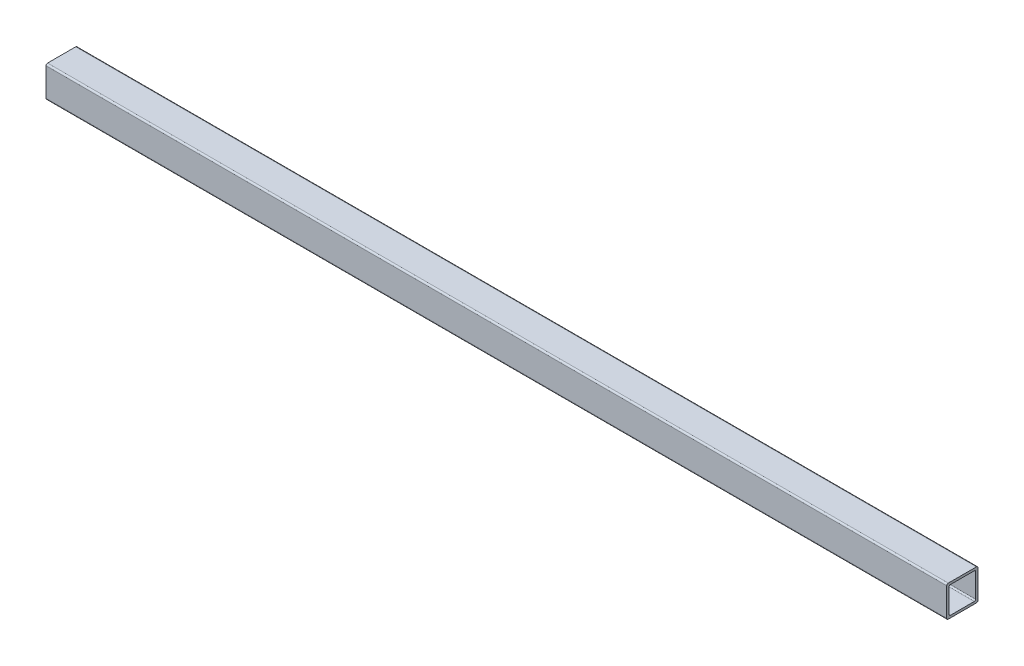
ISO-10303-21;
HEADER;
FILE_DESCRIPTION(('STEP AP214'),'2;1');
FILE_NAME('part.step','',(''),(''),'','','');
FILE_SCHEMA(('AUTOMOTIVE_DESIGN { 1 0 10303 214 1 1 1 1 }'));
ENDSEC;
DATA;
#1=APPLICATION_CONTEXT('core data for automotive mechanical design processes');
#2=APPLICATION_PROTOCOL_DEFINITION('international standard','automotive_design',2000,#1);
#3=PRODUCT_CONTEXT('',#1,'mechanical');
#4=PRODUCT('Part','Part','',(#3));
#5=PRODUCT_RELATED_PRODUCT_CATEGORY('part','',(#4));
#6=PRODUCT_DEFINITION_FORMATION('','',#4);
#7=PRODUCT_DEFINITION_CONTEXT('part definition',#1,'design');
#8=PRODUCT_DEFINITION('design','',#6,#7);
#9=PRODUCT_DEFINITION_SHAPE('','',#8);
#10=(LENGTH_UNIT() NAMED_UNIT(*) SI_UNIT(.MILLI.,.METRE.));
#11=(NAMED_UNIT(*) PLANE_ANGLE_UNIT() SI_UNIT($,.RADIAN.));
#12=(NAMED_UNIT(*) SI_UNIT($,.STERADIAN.) SOLID_ANGLE_UNIT());
#13=UNCERTAINTY_MEASURE_WITH_UNIT(LENGTH_MEASURE(1.E-05),#10,'distance_accuracy_value','');
#14=(GEOMETRIC_REPRESENTATION_CONTEXT(3) GLOBAL_UNCERTAINTY_ASSIGNED_CONTEXT((#13)) GLOBAL_UNIT_ASSIGNED_CONTEXT((#10,
#11,#12)) REPRESENTATION_CONTEXT('',''));
#15=CARTESIAN_POINT('',(0.,0.,0.));
#16=DIRECTION('',(0.,0.,1.));
#17=DIRECTION('',(1.,0.,0.));
#18=AXIS2_PLACEMENT_3D('',#15,#16,#17);
#19=CARTESIAN_POINT('',(-914.4,-28.575,-28.575));
#20=DIRECTION('',(1.,0.,0.));
#21=DIRECTION('',(0.,1.,0.));
#22=AXIS2_PLACEMENT_3D('',#19,#20,#21);
#23=CYLINDRICAL_SURFACE('',#22,3.175);
#24=CARTESIAN_POINT('',(914.4,-28.5750000000003,-28.575));
#25=DIRECTION('',(-1.,0.,0.));
#26=DIRECTION('',(0.,-1.,0.));
#27=AXIS2_PLACEMENT_3D('',#24,#25,#26);
#28=CIRCLE('',#27,3.175);
#29=CARTESIAN_POINT('',(914.4,-28.5750000000003,-31.75));
#30=VERTEX_POINT('',#29);
#31=CARTESIAN_POINT('',(914.4,-31.7500000000003,-28.575));
#32=VERTEX_POINT('',#31);
#33=EDGE_CURVE('E252',#30,#32,#28,.T.);
#34=ORIENTED_EDGE('',*,*,#33,.T.);
#35=DIRECTION('',(1.,0.,0.));
#36=VECTOR('',#35,1.);
#37=CARTESIAN_POINT('',(-914.4,-31.75,-28.575));
#38=LINE('',#37,#36);
#39=CARTESIAN_POINT('',(-914.4,-31.75,-28.575));
#40=VERTEX_POINT('',#39);
#41=EDGE_CURVE('E12',#40,#32,#38,.T.);
#42=ORIENTED_EDGE('',*,*,#41,.F.);
#43=CARTESIAN_POINT('',(-914.4,-28.575,-28.575));
#44=DIRECTION('',(-1.,0.,0.));
#45=DIRECTION('',(0.,-1.,0.));
#46=AXIS2_PLACEMENT_3D('',#43,#44,#45);
#47=CIRCLE('',#46,3.175);
#48=CARTESIAN_POINT('',(-914.4,-28.575,-31.75));
#49=VERTEX_POINT('',#48);
#50=EDGE_CURVE('E358',#49,#40,#47,.T.);
#51=ORIENTED_EDGE('',*,*,#50,.F.);
#52=DIRECTION('',(1.,0.,0.));
#53=VECTOR('',#52,1.);
#54=CARTESIAN_POINT('',(-914.4,-28.575,-31.75));
#55=LINE('',#54,#53);
#56=EDGE_CURVE('E275',#49,#30,#55,.T.);
#57=ORIENTED_EDGE('',*,*,#56,.T.);
#58=EDGE_LOOP('',(#34,#42,#51,#57));
#59=FACE_BOUND('',#58,.T.);
#60=ADVANCED_FACE('F67',(#59),#23,.T.);
#61=CARTESIAN_POINT('',(-914.4,-31.75,-28.575));
#62=DIRECTION('',(0.,1.,0.));
#63=DIRECTION('',(-1.,0.,0.));
#64=AXIS2_PLACEMENT_3D('',#61,#62,#63);
#65=PLANE('',#64);
#66=DIRECTION('',(0.,0.,1.));
#67=VECTOR('',#66,1.);
#68=CARTESIAN_POINT('',(914.4,-31.7500000000003,-28.575));
#69=LINE('',#68,#67);
#70=CARTESIAN_POINT('',(914.4,-31.7500000000003,28.575));
#71=VERTEX_POINT('',#70);
#72=EDGE_CURVE('E256',#32,#71,#69,.T.);
#73=ORIENTED_EDGE('',*,*,#72,.T.);
#74=DIRECTION('',(1.,0.,0.));
#75=VECTOR('',#74,1.);
#76=CARTESIAN_POINT('',(-914.4,-31.75,28.575));
#77=LINE('',#76,#75);
#78=CARTESIAN_POINT('',(-914.4,-31.75,28.575));
#79=VERTEX_POINT('',#78);
#80=EDGE_CURVE('E78',#79,#71,#77,.T.);
#81=ORIENTED_EDGE('',*,*,#80,.F.);
#82=DIRECTION('',(0.,0.,1.));
#83=VECTOR('',#82,1.);
#84=CARTESIAN_POINT('',(-914.4,-31.75,-28.575));
#85=LINE('',#84,#83);
#86=EDGE_CURVE('E361',#40,#79,#85,.T.);
#87=ORIENTED_EDGE('',*,*,#86,.F.);
#88=ORIENTED_EDGE('',*,*,#41,.T.);
#89=EDGE_LOOP('',(#73,#81,#87,#88));
#90=FACE_BOUND('',#89,.T.);
#91=ADVANCED_FACE('F400',(#90),#65,.F.);
#92=CARTESIAN_POINT('',(-914.4,-28.575,28.575));
#93=DIRECTION('',(1.,0.,0.));
#94=DIRECTION('',(0.,1.,0.));
#95=AXIS2_PLACEMENT_3D('',#92,#93,#94);
#96=CYLINDRICAL_SURFACE('',#95,3.175);
#97=CARTESIAN_POINT('',(914.4,-28.5750000000003,28.575));
#98=DIRECTION('',(-1.,0.,0.));
#99=DIRECTION('',(0.,-1.,0.));
#100=AXIS2_PLACEMENT_3D('',#97,#98,#99);
#101=CIRCLE('',#100,3.175);
#102=CARTESIAN_POINT('',(914.4,-28.5750000000003,31.75));
#103=VERTEX_POINT('',#102);
#104=EDGE_CURVE('E259',#71,#103,#101,.T.);
#105=ORIENTED_EDGE('',*,*,#104,.T.);
#106=DIRECTION('',(1.,0.,0.));
#107=VECTOR('',#106,1.);
#108=CARTESIAN_POINT('',(-914.4,-28.575,31.75));
#109=LINE('',#108,#107);
#110=CARTESIAN_POINT('',(-914.4,-28.575,31.75));
#111=VERTEX_POINT('',#110);
#112=EDGE_CURVE('E286',#111,#103,#109,.T.);
#113=ORIENTED_EDGE('',*,*,#112,.F.);
#114=CARTESIAN_POINT('',(-914.4,-28.575,28.575));
#115=DIRECTION('',(-1.,0.,0.));
#116=DIRECTION('',(0.,-1.,0.));
#117=AXIS2_PLACEMENT_3D('',#114,#115,#116);
#118=CIRCLE('',#117,3.175);
#119=EDGE_CURVE('E364',#79,#111,#118,.T.);
#120=ORIENTED_EDGE('',*,*,#119,.F.);
#121=ORIENTED_EDGE('',*,*,#80,.T.);
#122=EDGE_LOOP('',(#105,#113,#120,#121));
#123=FACE_BOUND('',#122,.T.);
#124=ADVANCED_FACE('F405',(#123),#96,.T.);
#125=CARTESIAN_POINT('',(-914.4,-28.575,31.75));
#126=DIRECTION('',(0.,0.,-1.));
#127=DIRECTION('',(-1.,0.,0.));
#128=AXIS2_PLACEMENT_3D('',#125,#126,#127);
#129=PLANE('',#128);
#130=DIRECTION('',(0.,1.,0.));
#131=VECTOR('',#130,1.);
#132=CARTESIAN_POINT('',(914.4,-28.5750000000003,31.75));
#133=LINE('',#132,#131);
#134=CARTESIAN_POINT('',(914.4,28.5749999999997,31.75));
#135=VERTEX_POINT('',#134);
#136=EDGE_CURVE('E262',#103,#135,#133,.T.);
#137=ORIENTED_EDGE('',*,*,#136,.T.);
#138=DIRECTION('',(1.,0.,0.));
#139=VECTOR('',#138,1.);
#140=CARTESIAN_POINT('',(-914.4,28.575,31.75));
#141=LINE('',#140,#139);
#142=CARTESIAN_POINT('',(-914.4,28.575,31.75));
#143=VERTEX_POINT('',#142);
#144=EDGE_CURVE('E282',#143,#135,#141,.T.);
#145=ORIENTED_EDGE('',*,*,#144,.F.);
#146=DIRECTION('',(0.,1.,0.));
#147=VECTOR('',#146,1.);
#148=CARTESIAN_POINT('',(-914.4,-28.575,31.75));
#149=LINE('',#148,#147);
#150=EDGE_CURVE('E367',#111,#143,#149,.T.);
#151=ORIENTED_EDGE('',*,*,#150,.F.);
#152=ORIENTED_EDGE('',*,*,#112,.T.);
#153=EDGE_LOOP('',(#137,#145,#151,#152));
#154=FACE_BOUND('',#153,.T.);
#155=ADVANCED_FACE('F375',(#154),#129,.F.);
#156=CARTESIAN_POINT('',(-914.4,28.575,28.575));
#157=DIRECTION('',(1.,0.,0.));
#158=DIRECTION('',(0.,1.,0.));
#159=AXIS2_PLACEMENT_3D('',#156,#157,#158);
#160=CYLINDRICAL_SURFACE('',#159,3.175);
#161=CARTESIAN_POINT('',(914.4,28.5749999999997,28.575));
#162=DIRECTION('',(-1.,0.,0.));
#163=DIRECTION('',(0.,-1.,0.));
#164=AXIS2_PLACEMENT_3D('',#161,#162,#163);
#165=CIRCLE('',#164,3.175);
#166=CARTESIAN_POINT('',(914.4,31.7499999999997,28.575));
#167=VERTEX_POINT('',#166);
#168=EDGE_CURVE('E265',#135,#167,#165,.T.);
#169=ORIENTED_EDGE('',*,*,#168,.T.);
#170=DIRECTION('',(1.,0.,0.));
#171=VECTOR('',#170,1.);
#172=CARTESIAN_POINT('',(-914.4,31.75,28.575));
#173=LINE('',#172,#171);
#174=CARTESIAN_POINT('',(-914.4,31.75,28.575));
#175=VERTEX_POINT('',#174);
#176=EDGE_CURVE('E209',#175,#167,#173,.T.);
#177=ORIENTED_EDGE('',*,*,#176,.F.);
#178=CARTESIAN_POINT('',(-914.4,28.575,28.575));
#179=DIRECTION('',(-1.,0.,0.));
#180=DIRECTION('',(0.,-1.,0.));
#181=AXIS2_PLACEMENT_3D('',#178,#179,#180);
#182=CIRCLE('',#181,3.175);
#183=EDGE_CURVE('E198',#143,#175,#182,.T.);
#184=ORIENTED_EDGE('',*,*,#183,.F.);
#185=ORIENTED_EDGE('',*,*,#144,.T.);
#186=EDGE_LOOP('',(#169,#177,#184,#185));
#187=FACE_BOUND('',#186,.T.);
#188=ADVANCED_FACE('F379',(#187),#160,.T.);
#189=CARTESIAN_POINT('',(-914.4,31.75,-28.575));
#190=DIRECTION('',(0.,-1.,0.));
#191=DIRECTION('',(1.,0.,0.));
#192=AXIS2_PLACEMENT_3D('',#189,#190,#191);
#193=PLANE('',#192);
#194=DIRECTION('',(0.,0.,-1.));
#195=VECTOR('',#194,1.);
#196=CARTESIAN_POINT('',(914.4,31.7499999999997,-28.575));
#197=LINE('',#196,#195);
#198=CARTESIAN_POINT('',(914.4,31.7499999999997,-28.575));
#199=VERTEX_POINT('',#198);
#200=EDGE_CURVE('E207',#167,#199,#197,.T.);
#201=ORIENTED_EDGE('',*,*,#200,.T.);
#202=DIRECTION('',(1.,0.,0.));
#203=VECTOR('',#202,1.);
#204=CARTESIAN_POINT('',(-914.4,31.75,-28.575));
#205=LINE('',#204,#203);
#206=CARTESIAN_POINT('',(-914.4,31.75,-28.575));
#207=VERTEX_POINT('',#206);
#208=EDGE_CURVE('E204',#207,#199,#205,.T.);
#209=ORIENTED_EDGE('',*,*,#208,.F.);
#210=DIRECTION('',(0.,0.,-1.));
#211=VECTOR('',#210,1.);
#212=CARTESIAN_POINT('',(-914.4,31.75,-28.575));
#213=LINE('',#212,#211);
#214=EDGE_CURVE('E192',#175,#207,#213,.T.);
#215=ORIENTED_EDGE('',*,*,#214,.F.);
#216=ORIENTED_EDGE('',*,*,#176,.T.);
#217=EDGE_LOOP('',(#201,#209,#215,#216));
#218=FACE_BOUND('',#217,.T.);
#219=ADVANCED_FACE('F205',(#218),#193,.F.);
#220=CARTESIAN_POINT('',(-914.4,28.575,-28.575));
#221=DIRECTION('',(1.,0.,0.));
#222=DIRECTION('',(0.,1.,0.));
#223=AXIS2_PLACEMENT_3D('',#220,#221,#222);
#224=CYLINDRICAL_SURFACE('',#223,3.175);
#225=CARTESIAN_POINT('',(914.4,28.5749999999997,-28.575));
#226=DIRECTION('',(-1.,0.,0.));
#227=DIRECTION('',(0.,1.,0.));
#228=AXIS2_PLACEMENT_3D('',#225,#226,#227);
#229=CIRCLE('',#228,3.175);
#230=CARTESIAN_POINT('',(914.4,28.5749999999997,-31.75));
#231=VERTEX_POINT('',#230);
#232=EDGE_CURVE('E140',#199,#231,#229,.T.);
#233=ORIENTED_EDGE('',*,*,#232,.T.);
#234=DIRECTION('',(1.,0.,0.));
#235=VECTOR('',#234,1.);
#236=CARTESIAN_POINT('',(-914.4,28.575,-31.75));
#237=LINE('',#236,#235);
#238=CARTESIAN_POINT('',(-914.4,28.575,-31.75));
#239=VERTEX_POINT('',#238);
#240=EDGE_CURVE('E210',#239,#231,#237,.T.);
#241=ORIENTED_EDGE('',*,*,#240,.F.);
#242=CARTESIAN_POINT('',(-914.4,28.575,-28.575));
#243=DIRECTION('',(-1.,0.,0.));
#244=DIRECTION('',(0.,1.,0.));
#245=AXIS2_PLACEMENT_3D('',#242,#243,#244);
#246=CIRCLE('',#245,3.175);
#247=EDGE_CURVE('E196',#207,#239,#246,.T.);
#248=ORIENTED_EDGE('',*,*,#247,.F.);
#249=ORIENTED_EDGE('',*,*,#208,.T.);
#250=EDGE_LOOP('',(#233,#241,#248,#249));
#251=FACE_BOUND('',#250,.T.);
#252=ADVANCED_FACE('F212',(#251),#224,.T.);
#253=CARTESIAN_POINT('',(-914.4,24.27732,-24.27732));
#254=DIRECTION('',(1.,0.,0.));
#255=DIRECTION('',(0.,1.,0.));
#256=AXIS2_PLACEMENT_3D('',#253,#254,#255);
#257=CYLINDRICAL_SURFACE('',#256,2.69748);
#258=CARTESIAN_POINT('',(914.4,24.2773199999997,-24.27732));
#259=DIRECTION('',(-1.,0.,0.));
#260=DIRECTION('',(0.,1.,0.));
#261=AXIS2_PLACEMENT_3D('',#258,#259,#260);
#262=CIRCLE('',#261,2.69748);
#263=CARTESIAN_POINT('',(914.4,26.9747999999997,-24.27732));
#264=VERTEX_POINT('',#263);
#265=CARTESIAN_POINT('',(914.4,24.2773199999997,-26.9748));
#266=VERTEX_POINT('',#265);
#267=EDGE_CURVE('E220',#264,#266,#262,.T.);
#268=ORIENTED_EDGE('',*,*,#267,.F.);
#269=DIRECTION('',(1.,0.,0.));
#270=VECTOR('',#269,1.);
#271=CARTESIAN_POINT('',(-914.4,26.9748,-24.27732));
#272=LINE('',#271,#270);
#273=CARTESIAN_POINT('',(-914.4,26.9748,-24.27732));
#274=VERTEX_POINT('',#273);
#275=EDGE_CURVE('E71',#274,#264,#272,.T.);
#276=ORIENTED_EDGE('',*,*,#275,.F.);
#277=CARTESIAN_POINT('',(-914.4,24.27732,-24.27732));
#278=DIRECTION('',(-1.,0.,0.));
#279=DIRECTION('',(0.,1.,0.));
#280=AXIS2_PLACEMENT_3D('',#277,#278,#279);
#281=CIRCLE('',#280,2.69748);
#282=CARTESIAN_POINT('',(-914.4,24.27732,-26.9748));
#283=VERTEX_POINT('',#282);
#284=EDGE_CURVE('E274',#274,#283,#281,.T.);
#285=ORIENTED_EDGE('',*,*,#284,.T.);
#286=DIRECTION('',(1.,0.,0.));
#287=VECTOR('',#286,1.);
#288=CARTESIAN_POINT('',(-914.4,24.27732,-26.9748));
#289=LINE('',#288,#287);
#290=EDGE_CURVE('E216',#283,#266,#289,.T.);
#291=ORIENTED_EDGE('',*,*,#290,.T.);
#292=EDGE_LOOP('',(#268,#276,#285,#291));
#293=FACE_BOUND('',#292,.T.);
#294=ADVANCED_FACE('F69',(#293),#257,.F.);
#295=CARTESIAN_POINT('',(-914.4,26.9748,24.27732));
#296=DIRECTION('',(0.,-1.,0.));
#297=DIRECTION('',(0.,0.,-1.));
#298=AXIS2_PLACEMENT_3D('',#295,#296,#297);
#299=PLANE('',#298);
#300=DIRECTION('',(0.,0.,-1.));
#301=VECTOR('',#300,1.);
#302=CARTESIAN_POINT('',(914.4,26.9747999999997,24.27732));
#303=LINE('',#302,#301);
#304=CARTESIAN_POINT('',(914.4,26.9747999999997,24.27732));
#305=VERTEX_POINT('',#304);
#306=EDGE_CURVE('E224',#305,#264,#303,.T.);
#307=ORIENTED_EDGE('',*,*,#306,.F.);
#308=DIRECTION('',(1.,0.,0.));
#309=VECTOR('',#308,1.);
#310=CARTESIAN_POINT('',(-914.4,26.9748,24.27732));
#311=LINE('',#310,#309);
#312=CARTESIAN_POINT('',(-914.4,26.9748,24.27732));
#313=VERTEX_POINT('',#312);
#314=EDGE_CURVE('E309',#313,#305,#311,.T.);
#315=ORIENTED_EDGE('',*,*,#314,.F.);
#316=DIRECTION('',(0.,0.,-1.));
#317=VECTOR('',#316,1.);
#318=CARTESIAN_POINT('',(-914.4,26.9748,24.27732));
#319=LINE('',#318,#317);
#320=EDGE_CURVE('E320',#313,#274,#319,.T.);
#321=ORIENTED_EDGE('',*,*,#320,.T.);
#322=ORIENTED_EDGE('',*,*,#275,.T.);
#323=EDGE_LOOP('',(#307,#315,#321,#322));
#324=FACE_BOUND('',#323,.T.);
#325=ADVANCED_FACE('F318',(#324),#299,.T.);
#326=CARTESIAN_POINT('',(-914.4,24.27732,24.27732));
#327=DIRECTION('',(1.,0.,0.));
#328=DIRECTION('',(0.,1.,0.));
#329=AXIS2_PLACEMENT_3D('',#326,#327,#328);
#330=CYLINDRICAL_SURFACE('',#329,2.69748000000001);
#331=CARTESIAN_POINT('',(914.4,24.2773199999997,24.27732));
#332=DIRECTION('',(-1.,0.,0.));
#333=DIRECTION('',(0.,-1.,0.));
#334=AXIS2_PLACEMENT_3D('',#331,#332,#333);
#335=CIRCLE('',#334,2.69748000000001);
#336=CARTESIAN_POINT('',(914.4,24.2773199999997,26.9748));
#337=VERTEX_POINT('',#336);
#338=EDGE_CURVE('E228',#337,#305,#335,.T.);
#339=ORIENTED_EDGE('',*,*,#338,.F.);
#340=DIRECTION('',(1.,0.,0.));
#341=VECTOR('',#340,1.);
#342=CARTESIAN_POINT('',(-914.4,24.27732,26.9748));
#343=LINE('',#342,#341);
#344=CARTESIAN_POINT('',(-914.4,24.27732,26.9748));
#345=VERTEX_POINT('',#344);
#346=EDGE_CURVE('E307',#345,#337,#343,.T.);
#347=ORIENTED_EDGE('',*,*,#346,.F.);
#348=CARTESIAN_POINT('',(-914.4,24.27732,24.27732));
#349=DIRECTION('',(-1.,0.,0.));
#350=DIRECTION('',(0.,-1.,0.));
#351=AXIS2_PLACEMENT_3D('',#348,#349,#350);
#352=CIRCLE('',#351,2.69748000000001);
#353=EDGE_CURVE('E328',#345,#313,#352,.T.);
#354=ORIENTED_EDGE('',*,*,#353,.T.);
#355=ORIENTED_EDGE('',*,*,#314,.T.);
#356=EDGE_LOOP('',(#339,#347,#354,#355));
#357=FACE_BOUND('',#356,.T.);
#358=ADVANCED_FACE('F326',(#357),#330,.F.);
#359=CARTESIAN_POINT('',(-914.4,-24.27732,26.9748));
#360=DIRECTION('',(0.,0.,-1.));
#361=DIRECTION('',(0.,1.,0.));
#362=AXIS2_PLACEMENT_3D('',#359,#360,#361);
#363=PLANE('',#362);
#364=DIRECTION('',(0.,1.,0.));
#365=VECTOR('',#364,1.);
#366=CARTESIAN_POINT('',(914.4,-24.2773200000003,26.9748));
#367=LINE('',#366,#365);
#368=CARTESIAN_POINT('',(914.4,-24.2773200000003,26.9748));
#369=VERTEX_POINT('',#368);
#370=EDGE_CURVE('E232',#369,#337,#367,.T.);
#371=ORIENTED_EDGE('',*,*,#370,.F.);
#372=DIRECTION('',(1.,0.,0.));
#373=VECTOR('',#372,1.);
#374=CARTESIAN_POINT('',(-914.4,-24.27732,26.9748));
#375=LINE('',#374,#373);
#376=CARTESIAN_POINT('',(-914.4,-24.27732,26.9748));
#377=VERTEX_POINT('',#376);
#378=EDGE_CURVE('E304',#377,#369,#375,.T.);
#379=ORIENTED_EDGE('',*,*,#378,.F.);
#380=DIRECTION('',(0.,1.,0.));
#381=VECTOR('',#380,1.);
#382=CARTESIAN_POINT('',(-914.4,-24.27732,26.9748));
#383=LINE('',#382,#381);
#384=EDGE_CURVE('E334',#377,#345,#383,.T.);
#385=ORIENTED_EDGE('',*,*,#384,.T.);
#386=ORIENTED_EDGE('',*,*,#346,.T.);
#387=EDGE_LOOP('',(#371,#379,#385,#386));
#388=FACE_BOUND('',#387,.T.);
#389=ADVANCED_FACE('F338',(#388),#363,.T.);
#390=CARTESIAN_POINT('',(-914.4,-24.27732,24.27732));
#391=DIRECTION('',(1.,0.,0.));
#392=DIRECTION('',(0.,1.,0.));
#393=AXIS2_PLACEMENT_3D('',#390,#391,#392);
#394=CYLINDRICAL_SURFACE('',#393,2.69748);
#395=CARTESIAN_POINT('',(914.4,-24.2773200000003,24.27732));
#396=DIRECTION('',(-1.,0.,0.));
#397=DIRECTION('',(0.,1.,0.));
#398=AXIS2_PLACEMENT_3D('',#395,#396,#397);
#399=CIRCLE('',#398,2.69748);
#400=CARTESIAN_POINT('',(914.4,-26.9748000000003,24.27732));
#401=VERTEX_POINT('',#400);
#402=EDGE_CURVE('E236',#401,#369,#399,.T.);
#403=ORIENTED_EDGE('',*,*,#402,.F.);
#404=DIRECTION('',(1.,0.,0.));
#405=VECTOR('',#404,1.);
#406=CARTESIAN_POINT('',(-914.4,-26.9748,24.27732));
#407=LINE('',#406,#405);
#408=CARTESIAN_POINT('',(-914.4,-26.9748,24.27732));
#409=VERTEX_POINT('',#408);
#410=EDGE_CURVE('E301',#409,#401,#407,.T.);
#411=ORIENTED_EDGE('',*,*,#410,.F.);
#412=CARTESIAN_POINT('',(-914.4,-24.27732,24.27732));
#413=DIRECTION('',(-1.,0.,0.));
#414=DIRECTION('',(0.,1.,0.));
#415=AXIS2_PLACEMENT_3D('',#412,#413,#414);
#416=CIRCLE('',#415,2.69748);
#417=EDGE_CURVE('E340',#409,#377,#416,.T.);
#418=ORIENTED_EDGE('',*,*,#417,.T.);
#419=ORIENTED_EDGE('',*,*,#378,.T.);
#420=EDGE_LOOP('',(#403,#411,#418,#419));
#421=FACE_BOUND('',#420,.T.);
#422=ADVANCED_FACE('F416',(#421),#394,.F.);
#423=CARTESIAN_POINT('',(-914.4,-26.9748,24.27732));
#424=DIRECTION('',(0.,1.,0.));
#425=DIRECTION('',(-1.,0.,0.));
#426=AXIS2_PLACEMENT_3D('',#423,#424,#425);
#427=PLANE('',#426);
#428=DIRECTION('',(0.,0.,1.));
#429=VECTOR('',#428,1.);
#430=CARTESIAN_POINT('',(914.4,-26.9748000000003,24.27732));
#431=LINE('',#430,#429);
#432=CARTESIAN_POINT('',(914.4,-26.9748000000003,-24.27732));
#433=VERTEX_POINT('',#432);
#434=EDGE_CURVE('E240',#433,#401,#431,.T.);
#435=ORIENTED_EDGE('',*,*,#434,.F.);
#436=DIRECTION('',(1.,0.,0.));
#437=VECTOR('',#436,1.);
#438=CARTESIAN_POINT('',(-914.4,-26.9748,-24.27732));
#439=LINE('',#438,#437);
#440=CARTESIAN_POINT('',(-914.4,-26.9748,-24.27732));
#441=VERTEX_POINT('',#440);
#442=EDGE_CURVE('E298',#441,#433,#439,.T.);
#443=ORIENTED_EDGE('',*,*,#442,.F.);
#444=DIRECTION('',(0.,0.,1.));
#445=VECTOR('',#444,1.);
#446=CARTESIAN_POINT('',(-914.4,-26.9748,24.27732));
#447=LINE('',#446,#445);
#448=EDGE_CURVE('E343',#441,#409,#447,.T.);
#449=ORIENTED_EDGE('',*,*,#448,.T.);
#450=ORIENTED_EDGE('',*,*,#410,.T.);
#451=EDGE_LOOP('',(#435,#443,#449,#450));
#452=FACE_BOUND('',#451,.T.);
#453=ADVANCED_FACE('F412',(#452),#427,.T.);
#454=CARTESIAN_POINT('',(-914.4,-24.27732,-24.27732));
#455=DIRECTION('',(1.,0.,0.));
#456=DIRECTION('',(0.,1.,0.));
#457=AXIS2_PLACEMENT_3D('',#454,#455,#456);
#458=CYLINDRICAL_SURFACE('',#457,2.69748);
#459=CARTESIAN_POINT('',(914.4,-24.2773200000003,-24.27732));
#460=DIRECTION('',(-1.,0.,0.));
#461=DIRECTION('',(0.,1.,0.));
#462=AXIS2_PLACEMENT_3D('',#459,#460,#461);
#463=CIRCLE('',#462,2.69748);
#464=CARTESIAN_POINT('',(914.4,-24.2773200000003,-26.9748));
#465=VERTEX_POINT('',#464);
#466=EDGE_CURVE('E244',#465,#433,#463,.T.);
#467=ORIENTED_EDGE('',*,*,#466,.F.);
#468=DIRECTION('',(1.,0.,0.));
#469=VECTOR('',#468,1.);
#470=CARTESIAN_POINT('',(-914.4,-24.27732,-26.9748));
#471=LINE('',#470,#469);
#472=CARTESIAN_POINT('',(-914.4,-24.27732,-26.9748));
#473=VERTEX_POINT('',#472);
#474=EDGE_CURVE('E295',#473,#465,#471,.T.);
#475=ORIENTED_EDGE('',*,*,#474,.F.);
#476=CARTESIAN_POINT('',(-914.4,-24.27732,-24.27732));
#477=DIRECTION('',(-1.,0.,0.));
#478=DIRECTION('',(0.,1.,0.));
#479=AXIS2_PLACEMENT_3D('',#476,#477,#478);
#480=CIRCLE('',#479,2.69748);
#481=EDGE_CURVE('E350',#473,#441,#480,.T.);
#482=ORIENTED_EDGE('',*,*,#481,.T.);
#483=ORIENTED_EDGE('',*,*,#442,.T.);
#484=EDGE_LOOP('',(#467,#475,#482,#483));
#485=FACE_BOUND('',#484,.T.);
#486=ADVANCED_FACE('F394',(#485),#458,.F.);
#487=CARTESIAN_POINT('',(-914.4,-24.27732,-26.9748));
#488=DIRECTION('',(0.,0.,1.));
#489=DIRECTION('',(0.,-1.,0.));
#490=AXIS2_PLACEMENT_3D('',#487,#488,#489);
#491=PLANE('',#490);
#492=DIRECTION('',(0.,-1.,0.));
#493=VECTOR('',#492,1.);
#494=CARTESIAN_POINT('',(914.4,-24.2773200000003,-26.9748));
#495=LINE('',#494,#493);
#496=EDGE_CURVE('E248',#266,#465,#495,.T.);
#497=ORIENTED_EDGE('',*,*,#496,.F.);
#498=ORIENTED_EDGE('',*,*,#290,.F.);
#499=DIRECTION('',(0.,-1.,0.));
#500=VECTOR('',#499,1.);
#501=CARTESIAN_POINT('',(-914.4,-24.27732,-26.9748));
#502=LINE('',#501,#500);
#503=EDGE_CURVE('E354',#283,#473,#502,.T.);
#504=ORIENTED_EDGE('',*,*,#503,.T.);
#505=ORIENTED_EDGE('',*,*,#474,.T.);
#506=EDGE_LOOP('',(#497,#498,#504,#505));
#507=FACE_BOUND('',#506,.T.);
#508=ADVANCED_FACE('F387',(#507),#491,.T.);
#509=CARTESIAN_POINT('',(-914.4,-28.575,-31.75));
#510=DIRECTION('',(0.,0.,1.));
#511=DIRECTION('',(1.,0.,0.));
#512=AXIS2_PLACEMENT_3D('',#509,#510,#511);
#513=PLANE('',#512);
#514=DIRECTION('',(0.,-1.,0.));
#515=VECTOR('',#514,1.);
#516=CARTESIAN_POINT('',(914.4,-28.5750000000003,-31.75));
#517=LINE('',#516,#515);
#518=EDGE_CURVE('E146',#231,#30,#517,.T.);
#519=ORIENTED_EDGE('',*,*,#518,.T.);
#520=ORIENTED_EDGE('',*,*,#56,.F.);
#521=DIRECTION('',(0.,-1.,0.));
#522=VECTOR('',#521,1.);
#523=CARTESIAN_POINT('',(-914.4,-28.575,-31.75));
#524=LINE('',#523,#522);
#525=EDGE_CURVE('E87',#239,#49,#524,.T.);
#526=ORIENTED_EDGE('',*,*,#525,.F.);
#527=ORIENTED_EDGE('',*,*,#240,.T.);
#528=EDGE_LOOP('',(#519,#520,#526,#527));
#529=FACE_BOUND('',#528,.T.);
#530=ADVANCED_FACE('F385',(#529),#513,.F.);
#531=CARTESIAN_POINT('',(-914.4,-28.575,-28.575));
#532=DIRECTION('',(-1.,0.,0.));
#533=DIRECTION('',(0.,-1.,0.));
#534=AXIS2_PLACEMENT_3D('',#531,#532,#533);
#535=PLANE('',#534);
#536=ORIENTED_EDGE('',*,*,#284,.F.);
#537=ORIENTED_EDGE('',*,*,#320,.F.);
#538=ORIENTED_EDGE('',*,*,#353,.F.);
#539=ORIENTED_EDGE('',*,*,#384,.F.);
#540=ORIENTED_EDGE('',*,*,#417,.F.);
#541=ORIENTED_EDGE('',*,*,#448,.F.);
#542=ORIENTED_EDGE('',*,*,#481,.F.);
#543=ORIENTED_EDGE('',*,*,#503,.F.);
#544=EDGE_LOOP('',(#536,#537,#538,#539,#540,#541,#542,#543));
#545=FACE_BOUND('',#544,.T.);
#546=ORIENTED_EDGE('',*,*,#50,.T.);
#547=ORIENTED_EDGE('',*,*,#86,.T.);
#548=ORIENTED_EDGE('',*,*,#119,.T.);
#549=ORIENTED_EDGE('',*,*,#150,.T.);
#550=ORIENTED_EDGE('',*,*,#183,.T.);
#551=ORIENTED_EDGE('',*,*,#214,.T.);
#552=ORIENTED_EDGE('',*,*,#247,.T.);
#553=ORIENTED_EDGE('',*,*,#525,.T.);
#554=EDGE_LOOP('',(#546,#547,#548,#549,#550,#551,#552,#553));
#555=FACE_BOUND('',#554,.T.);
#556=ADVANCED_FACE('F194',(#545,#555),#535,.T.);
#557=CARTESIAN_POINT('',(914.4,-28.5750000000003,-28.575));
#558=DIRECTION('',(-1.,0.,0.));
#559=DIRECTION('',(0.,-1.,0.));
#560=AXIS2_PLACEMENT_3D('',#557,#558,#559);
#561=PLANE('',#560);
#562=ORIENTED_EDGE('',*,*,#267,.T.);
#563=ORIENTED_EDGE('',*,*,#496,.T.);
#564=ORIENTED_EDGE('',*,*,#466,.T.);
#565=ORIENTED_EDGE('',*,*,#434,.T.);
#566=ORIENTED_EDGE('',*,*,#402,.T.);
#567=ORIENTED_EDGE('',*,*,#370,.T.);
#568=ORIENTED_EDGE('',*,*,#338,.T.);
#569=ORIENTED_EDGE('',*,*,#306,.T.);
#570=EDGE_LOOP('',(#562,#563,#564,#565,#566,#567,#568,#569));
#571=FACE_BOUND('',#570,.T.);
#572=ORIENTED_EDGE('',*,*,#33,.F.);
#573=ORIENTED_EDGE('',*,*,#518,.F.);
#574=ORIENTED_EDGE('',*,*,#232,.F.);
#575=ORIENTED_EDGE('',*,*,#200,.F.);
#576=ORIENTED_EDGE('',*,*,#168,.F.);
#577=ORIENTED_EDGE('',*,*,#136,.F.);
#578=ORIENTED_EDGE('',*,*,#104,.F.);
#579=ORIENTED_EDGE('',*,*,#72,.F.);
#580=EDGE_LOOP('',(#572,#573,#574,#575,#576,#577,#578,#579));
#581=FACE_BOUND('',#580,.T.);
#582=ADVANCED_FACE('F323',(#571,#581),#561,.F.);
#583=CLOSED_SHELL('',(#60,#91,#124,#155,#188,#219,#252,#294,#325,#358,#389,#422,#453,#486,#508,
#530,#556,#582));
#584=MANIFOLD_SOLID_BREP('B2',#583);
#585=ADVANCED_BREP_SHAPE_REPRESENTATION('',(#18,#584),#14);
#586=SHAPE_DEFINITION_REPRESENTATION(#9,#585);
ENDSEC;
END-ISO-10303-21;
